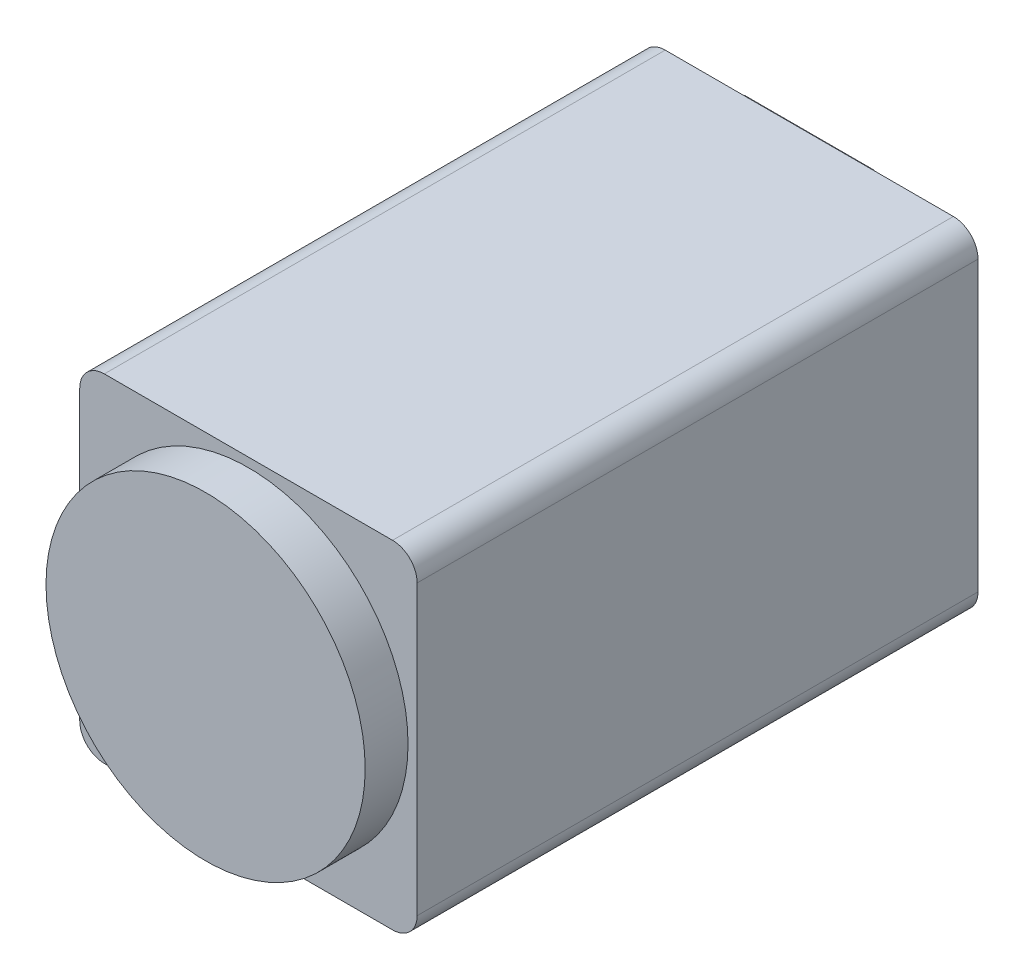
ISO-10303-21;
HEADER;
FILE_DESCRIPTION(('STEP AP214'),'2;1');
FILE_NAME('part.step','',(''),(''),'','','');
FILE_SCHEMA(('AUTOMOTIVE_DESIGN { 1 0 10303 214 1 1 1 1 }'));
ENDSEC;
DATA;
#1=APPLICATION_CONTEXT('core data for automotive mechanical design processes');
#2=APPLICATION_PROTOCOL_DEFINITION('international standard','automotive_design',2000,#1);
#3=PRODUCT_CONTEXT('',#1,'mechanical');
#4=PRODUCT('Part','Part','',(#3));
#5=PRODUCT_RELATED_PRODUCT_CATEGORY('part','',(#4));
#6=PRODUCT_DEFINITION_FORMATION('','',#4);
#7=PRODUCT_DEFINITION_CONTEXT('part definition',#1,'design');
#8=PRODUCT_DEFINITION('design','',#6,#7);
#9=PRODUCT_DEFINITION_SHAPE('','',#8);
#10=(LENGTH_UNIT() NAMED_UNIT(*) SI_UNIT(.MILLI.,.METRE.));
#11=(NAMED_UNIT(*) PLANE_ANGLE_UNIT() SI_UNIT($,.RADIAN.));
#12=(NAMED_UNIT(*) SI_UNIT($,.STERADIAN.) SOLID_ANGLE_UNIT());
#13=UNCERTAINTY_MEASURE_WITH_UNIT(LENGTH_MEASURE(1.E-05),#10,'distance_accuracy_value','');
#14=(GEOMETRIC_REPRESENTATION_CONTEXT(3) GLOBAL_UNCERTAINTY_ASSIGNED_CONTEXT((#13)) GLOBAL_UNIT_ASSIGNED_CONTEXT((#10,
#11,#12)) REPRESENTATION_CONTEXT('',''));
#15=CARTESIAN_POINT('',(0.,0.,0.));
#16=DIRECTION('',(0.,0.,1.));
#17=DIRECTION('',(1.,0.,0.));
#18=AXIS2_PLACEMENT_3D('',#15,#16,#17);
#19=CARTESIAN_POINT('',(2.7,2.7,61.5));
#20=DIRECTION('',(0.,0.,-1.));
#21=DIRECTION('',(-1.,0.,0.));
#22=AXIS2_PLACEMENT_3D('',#19,#20,#21);
#23=CYLINDRICAL_SURFACE('',#22,2.7);
#24=CARTESIAN_POINT('',(2.7,2.7,0.));
#25=DIRECTION('',(0.,0.,-1.));
#26=DIRECTION('',(-1.,0.,0.));
#27=AXIS2_PLACEMENT_3D('',#24,#25,#26);
#28=CIRCLE('',#27,2.7);
#29=CARTESIAN_POINT('',(2.70000000000002,0.,0.));
#30=VERTEX_POINT('',#29);
#31=CARTESIAN_POINT('',(0.,2.70000000000002,0.));
#32=VERTEX_POINT('',#31);
#33=EDGE_CURVE('E165',#30,#32,#28,.T.);
#34=ORIENTED_EDGE('',*,*,#33,.F.);
#35=DIRECTION('',(0.,0.,-1.));
#36=VECTOR('',#35,1.);
#37=CARTESIAN_POINT('',(2.70000000000002,0.,61.5));
#38=LINE('',#37,#36);
#39=CARTESIAN_POINT('',(2.70000000000002,0.,61.5));
#40=VERTEX_POINT('',#39);
#41=EDGE_CURVE('E56',#40,#30,#38,.T.);
#42=ORIENTED_EDGE('',*,*,#41,.F.);
#43=CARTESIAN_POINT('',(2.7,2.7,61.5));
#44=DIRECTION('',(0.,0.,-1.));
#45=DIRECTION('',(-1.,0.,0.));
#46=AXIS2_PLACEMENT_3D('',#43,#44,#45);
#47=CIRCLE('',#46,2.7);
#48=CARTESIAN_POINT('',(0.,2.70000000000002,61.5));
#49=VERTEX_POINT('',#48);
#50=EDGE_CURVE('E194',#40,#49,#47,.T.);
#51=ORIENTED_EDGE('',*,*,#50,.T.);
#52=DIRECTION('',(0.,0.,-1.));
#53=VECTOR('',#52,1.);
#54=CARTESIAN_POINT('',(0.,2.70000000000002,61.5));
#55=LINE('',#54,#53);
#56=EDGE_CURVE('E50',#49,#32,#55,.T.);
#57=ORIENTED_EDGE('',*,*,#56,.T.);
#58=EDGE_LOOP('',(#34,#42,#51,#57));
#59=FACE_BOUND('',#58,.T.);
#60=ADVANCED_FACE('F47',(#59),#23,.T.);
#61=CARTESIAN_POINT('',(2.70000000000002,0.,61.5));
#62=DIRECTION('',(0.,1.,0.));
#63=DIRECTION('',(0.,0.,1.));
#64=AXIS2_PLACEMENT_3D('',#61,#62,#63);
#65=PLANE('',#64);
#66=DIRECTION('',(1.,0.,0.));
#67=VECTOR('',#66,1.);
#68=CARTESIAN_POINT('',(2.70000000000002,0.,0.));
#69=LINE('',#68,#67);
#70=CARTESIAN_POINT('',(34.3,0.,0.));
#71=VERTEX_POINT('',#70);
#72=EDGE_CURVE('E191',#30,#71,#69,.T.);
#73=ORIENTED_EDGE('',*,*,#72,.T.);
#74=DIRECTION('',(0.,0.,-1.));
#75=VECTOR('',#74,1.);
#76=CARTESIAN_POINT('',(34.3,0.,61.5));
#77=LINE('',#76,#75);
#78=CARTESIAN_POINT('',(34.3,0.,61.5));
#79=VERTEX_POINT('',#78);
#80=EDGE_CURVE('E149',#79,#71,#77,.T.);
#81=ORIENTED_EDGE('',*,*,#80,.F.);
#82=DIRECTION('',(1.,0.,0.));
#83=VECTOR('',#82,1.);
#84=CARTESIAN_POINT('',(2.70000000000002,0.,61.5));
#85=LINE('',#84,#83);
#86=EDGE_CURVE('E135',#40,#79,#85,.T.);
#87=ORIENTED_EDGE('',*,*,#86,.F.);
#88=ORIENTED_EDGE('',*,*,#41,.T.);
#89=EDGE_LOOP('',(#73,#81,#87,#88));
#90=FACE_BOUND('',#89,.T.);
#91=ADVANCED_FACE('F214',(#90),#65,.F.);
#92=CARTESIAN_POINT('',(34.3,2.7,61.5));
#93=DIRECTION('',(0.,0.,-1.));
#94=DIRECTION('',(-1.,0.,0.));
#95=AXIS2_PLACEMENT_3D('',#92,#93,#94);
#96=CYLINDRICAL_SURFACE('',#95,2.7);
#97=CARTESIAN_POINT('',(34.3,2.7,0.));
#98=DIRECTION('',(0.,0.,1.));
#99=DIRECTION('',(1.,0.,0.));
#100=AXIS2_PLACEMENT_3D('',#97,#98,#99);
#101=CIRCLE('',#100,2.7);
#102=CARTESIAN_POINT('',(37.,2.7,0.));
#103=VERTEX_POINT('',#102);
#104=EDGE_CURVE('E145',#71,#103,#101,.T.);
#105=ORIENTED_EDGE('',*,*,#104,.T.);
#106=DIRECTION('',(0.,0.,-1.));
#107=VECTOR('',#106,1.);
#108=CARTESIAN_POINT('',(37.,2.7,61.5));
#109=LINE('',#108,#107);
#110=CARTESIAN_POINT('',(37.,2.7,61.5));
#111=VERTEX_POINT('',#110);
#112=EDGE_CURVE('E142',#111,#103,#109,.T.);
#113=ORIENTED_EDGE('',*,*,#112,.F.);
#114=CARTESIAN_POINT('',(34.3,2.7,61.5));
#115=DIRECTION('',(0.,0.,1.));
#116=DIRECTION('',(1.,0.,0.));
#117=AXIS2_PLACEMENT_3D('',#114,#115,#116);
#118=CIRCLE('',#117,2.7);
#119=EDGE_CURVE('E128',#79,#111,#118,.T.);
#120=ORIENTED_EDGE('',*,*,#119,.F.);
#121=ORIENTED_EDGE('',*,*,#80,.T.);
#122=EDGE_LOOP('',(#105,#113,#120,#121));
#123=FACE_BOUND('',#122,.T.);
#124=ADVANCED_FACE('F143',(#123),#96,.T.);
#125=CARTESIAN_POINT('',(37.,2.70000000000002,61.5));
#126=DIRECTION('',(-1.,0.,0.));
#127=DIRECTION('',(0.,0.,1.));
#128=AXIS2_PLACEMENT_3D('',#125,#126,#127);
#129=PLANE('',#128);
#130=DIRECTION('',(0.,1.,0.));
#131=VECTOR('',#130,1.);
#132=CARTESIAN_POINT('',(37.,2.70000000000002,0.));
#133=LINE('',#132,#131);
#134=CARTESIAN_POINT('',(37.,34.3,0.));
#135=VERTEX_POINT('',#134);
#136=EDGE_CURVE('E186',#103,#135,#133,.T.);
#137=ORIENTED_EDGE('',*,*,#136,.T.);
#138=DIRECTION('',(0.,0.,-1.));
#139=VECTOR('',#138,1.);
#140=CARTESIAN_POINT('',(37.,34.3,61.5));
#141=LINE('',#140,#139);
#142=CARTESIAN_POINT('',(37.,34.3,61.5));
#143=VERTEX_POINT('',#142);
#144=EDGE_CURVE('E150',#143,#135,#141,.T.);
#145=ORIENTED_EDGE('',*,*,#144,.F.);
#146=DIRECTION('',(0.,1.,0.));
#147=VECTOR('',#146,1.);
#148=CARTESIAN_POINT('',(37.,2.70000000000002,61.5));
#149=LINE('',#148,#147);
#150=EDGE_CURVE('E133',#111,#143,#149,.T.);
#151=ORIENTED_EDGE('',*,*,#150,.F.);
#152=ORIENTED_EDGE('',*,*,#112,.T.);
#153=EDGE_LOOP('',(#137,#145,#151,#152));
#154=FACE_BOUND('',#153,.T.);
#155=ADVANCED_FACE('F152',(#154),#129,.F.);
#156=CARTESIAN_POINT('',(34.3,34.3,61.5));
#157=DIRECTION('',(0.,0.,-1.));
#158=DIRECTION('',(-1.,0.,0.));
#159=AXIS2_PLACEMENT_3D('',#156,#157,#158);
#160=CYLINDRICAL_SURFACE('',#159,2.7);
#161=CARTESIAN_POINT('',(34.3,34.3,0.));
#162=DIRECTION('',(0.,0.,1.));
#163=DIRECTION('',(1.,0.,0.));
#164=AXIS2_PLACEMENT_3D('',#161,#162,#163);
#165=CIRCLE('',#164,2.7);
#166=CARTESIAN_POINT('',(34.3,37.,0.));
#167=VERTEX_POINT('',#166);
#168=EDGE_CURVE('E182',#135,#167,#165,.T.);
#169=ORIENTED_EDGE('',*,*,#168,.T.);
#170=DIRECTION('',(0.,0.,-1.));
#171=VECTOR('',#170,1.);
#172=CARTESIAN_POINT('',(34.3,37.,61.5));
#173=LINE('',#172,#171);
#174=CARTESIAN_POINT('',(34.3,37.,61.5));
#175=VERTEX_POINT('',#174);
#176=EDGE_CURVE('E201',#175,#167,#173,.T.);
#177=ORIENTED_EDGE('',*,*,#176,.F.);
#178=CARTESIAN_POINT('',(34.3,34.3,61.5));
#179=DIRECTION('',(0.,0.,1.));
#180=DIRECTION('',(1.,0.,0.));
#181=AXIS2_PLACEMENT_3D('',#178,#179,#180);
#182=CIRCLE('',#181,2.7);
#183=EDGE_CURVE('E156',#143,#175,#182,.T.);
#184=ORIENTED_EDGE('',*,*,#183,.F.);
#185=ORIENTED_EDGE('',*,*,#144,.T.);
#186=EDGE_LOOP('',(#169,#177,#184,#185));
#187=FACE_BOUND('',#186,.T.);
#188=ADVANCED_FACE('F233',(#187),#160,.T.);
#189=CARTESIAN_POINT('',(2.70000000000002,37.,61.5));
#190=DIRECTION('',(0.,1.,0.));
#191=DIRECTION('',(0.,0.,1.));
#192=AXIS2_PLACEMENT_3D('',#189,#190,#191);
#193=PLANE('',#192);
#194=DIRECTION('',(1.,0.,0.));
#195=VECTOR('',#194,1.);
#196=CARTESIAN_POINT('',(2.70000000000002,37.,0.));
#197=LINE('',#196,#195);
#198=CARTESIAN_POINT('',(2.70000000000002,37.,0.));
#199=VERTEX_POINT('',#198);
#200=EDGE_CURVE('E178',#199,#167,#197,.T.);
#201=ORIENTED_EDGE('',*,*,#200,.F.);
#202=DIRECTION('',(0.,0.,-1.));
#203=VECTOR('',#202,1.);
#204=CARTESIAN_POINT('',(2.70000000000002,37.,61.5));
#205=LINE('',#204,#203);
#206=CARTESIAN_POINT('',(2.70000000000002,37.,61.5));
#207=VERTEX_POINT('',#206);
#208=EDGE_CURVE('E204',#207,#199,#205,.T.);
#209=ORIENTED_EDGE('',*,*,#208,.F.);
#210=DIRECTION('',(1.,0.,0.));
#211=VECTOR('',#210,1.);
#212=CARTESIAN_POINT('',(2.70000000000002,37.,61.5));
#213=LINE('',#212,#211);
#214=EDGE_CURVE('E159',#207,#175,#213,.T.);
#215=ORIENTED_EDGE('',*,*,#214,.T.);
#216=ORIENTED_EDGE('',*,*,#176,.T.);
#217=EDGE_LOOP('',(#201,#209,#215,#216));
#218=FACE_BOUND('',#217,.T.);
#219=ADVANCED_FACE('F229',(#218),#193,.T.);
#220=CARTESIAN_POINT('',(2.7,34.3,61.5));
#221=DIRECTION('',(0.,0.,-1.));
#222=DIRECTION('',(-1.,0.,0.));
#223=AXIS2_PLACEMENT_3D('',#220,#221,#222);
#224=CYLINDRICAL_SURFACE('',#223,2.7);
#225=CARTESIAN_POINT('',(2.7,34.3,0.));
#226=DIRECTION('',(0.,0.,1.));
#227=DIRECTION('',(1.,0.,0.));
#228=AXIS2_PLACEMENT_3D('',#225,#226,#227);
#229=CIRCLE('',#228,2.7);
#230=CARTESIAN_POINT('',(0.,34.3,0.));
#231=VERTEX_POINT('',#230);
#232=EDGE_CURVE('E174',#199,#231,#229,.T.);
#233=ORIENTED_EDGE('',*,*,#232,.T.);
#234=DIRECTION('',(0.,0.,-1.));
#235=VECTOR('',#234,1.);
#236=CARTESIAN_POINT('',(0.,34.3,61.5));
#237=LINE('',#236,#235);
#238=CARTESIAN_POINT('',(0.,34.3,61.5));
#239=VERTEX_POINT('',#238);
#240=EDGE_CURVE('E206',#239,#231,#237,.T.);
#241=ORIENTED_EDGE('',*,*,#240,.F.);
#242=CARTESIAN_POINT('',(2.7,34.3,61.5));
#243=DIRECTION('',(0.,0.,1.));
#244=DIRECTION('',(1.,0.,0.));
#245=AXIS2_PLACEMENT_3D('',#242,#243,#244);
#246=CIRCLE('',#245,2.7);
#247=EDGE_CURVE('E219',#207,#239,#246,.T.);
#248=ORIENTED_EDGE('',*,*,#247,.F.);
#249=ORIENTED_EDGE('',*,*,#208,.T.);
#250=EDGE_LOOP('',(#233,#241,#248,#249));
#251=FACE_BOUND('',#250,.T.);
#252=ADVANCED_FACE('F236',(#251),#224,.T.);
#253=CARTESIAN_POINT('',(0.,2.70000000000002,61.5));
#254=DIRECTION('',(-1.,0.,0.));
#255=DIRECTION('',(0.,0.,1.));
#256=AXIS2_PLACEMENT_3D('',#253,#254,#255);
#257=PLANE('',#256);
#258=DIRECTION('',(0.,1.,0.));
#259=VECTOR('',#258,1.);
#260=CARTESIAN_POINT('',(0.,2.70000000000002,0.));
#261=LINE('',#260,#259);
#262=EDGE_CURVE('E169',#32,#231,#261,.T.);
#263=ORIENTED_EDGE('',*,*,#262,.F.);
#264=ORIENTED_EDGE('',*,*,#56,.F.);
#265=DIRECTION('',(0.,1.,0.));
#266=VECTOR('',#265,1.);
#267=CARTESIAN_POINT('',(0.,2.70000000000002,61.5));
#268=LINE('',#267,#266);
#269=EDGE_CURVE('E215',#49,#239,#268,.T.);
#270=ORIENTED_EDGE('',*,*,#269,.T.);
#271=ORIENTED_EDGE('',*,*,#240,.T.);
#272=EDGE_LOOP('',(#263,#264,#270,#271));
#273=FACE_BOUND('',#272,.T.);
#274=ADVANCED_FACE('F210',(#273),#257,.T.);
#275=CARTESIAN_POINT('',(2.7,2.7,61.5));
#276=DIRECTION('',(0.,0.,-1.));
#277=DIRECTION('',(-1.,0.,0.));
#278=AXIS2_PLACEMENT_3D('',#275,#276,#277);
#279=PLANE('',#278);
#280=CARTESIAN_POINT('',(18.5,18.5,61.5));
#281=DIRECTION('',(0.,0.,1.));
#282=DIRECTION('',(1.,0.,0.));
#283=AXIS2_PLACEMENT_3D('',#280,#281,#282);
#284=CIRCLE('',#283,17.5);
#285=CARTESIAN_POINT('',(36.,18.5,61.5));
#286=VERTEX_POINT('',#285);
#287=EDGE_CURVE('E12',#286,#286,#284,.T.);
#288=ORIENTED_EDGE('',*,*,#287,.F.);
#289=EDGE_LOOP('',(#288));
#290=FACE_BOUND('',#289,.T.);
#291=ORIENTED_EDGE('',*,*,#50,.F.);
#292=ORIENTED_EDGE('',*,*,#86,.T.);
#293=ORIENTED_EDGE('',*,*,#119,.T.);
#294=ORIENTED_EDGE('',*,*,#150,.T.);
#295=ORIENTED_EDGE('',*,*,#183,.T.);
#296=ORIENTED_EDGE('',*,*,#214,.F.);
#297=ORIENTED_EDGE('',*,*,#247,.T.);
#298=ORIENTED_EDGE('',*,*,#269,.F.);
#299=EDGE_LOOP('',(#291,#292,#293,#294,#295,#296,#297,#298));
#300=FACE_BOUND('',#299,.T.);
#301=ADVANCED_FACE('F131',(#290,#300),#279,.F.);
#302=CARTESIAN_POINT('',(2.7,2.7,0.));
#303=DIRECTION('',(0.,0.,-1.));
#304=DIRECTION('',(-1.,0.,0.));
#305=AXIS2_PLACEMENT_3D('',#302,#303,#304);
#306=PLANE('',#305);
#307=DIRECTION('',(-1.,0.,0.));
#308=VECTOR('',#307,1.);
#309=CARTESIAN_POINT('',(19.3089866841127,30.7562661281153,0.));
#310=LINE('',#309,#308);
#311=CARTESIAN_POINT('',(19.3089866841127,30.7562661281153,0.));
#312=VERTEX_POINT('',#311);
#313=CARTESIAN_POINT('',(5.08087224643994,30.7562661281153,0.));
#314=VERTEX_POINT('',#313);
#315=EDGE_CURVE('E404',#312,#314,#310,.T.);
#316=ORIENTED_EDGE('',*,*,#315,.T.);
#317=DIRECTION('',(0.,1.,0.));
#318=VECTOR('',#317,1.);
#319=CARTESIAN_POINT('',(5.08087224643994,15.203201014323,0.));
#320=LINE('',#319,#318);
#321=CARTESIAN_POINT('',(5.08087224643994,15.203201014323,0.));
#322=VERTEX_POINT('',#321);
#323=EDGE_CURVE('E408',#322,#314,#320,.T.);
#324=ORIENTED_EDGE('',*,*,#323,.F.);
#325=DIRECTION('',(-1.,0.,0.));
#326=VECTOR('',#325,1.);
#327=CARTESIAN_POINT('',(19.3089866841127,15.203201014323,0.));
#328=LINE('',#327,#326);
#329=CARTESIAN_POINT('',(19.3089866841127,15.203201014323,0.));
#330=VERTEX_POINT('',#329);
#331=EDGE_CURVE('E411',#330,#322,#328,.T.);
#332=ORIENTED_EDGE('',*,*,#331,.F.);
#333=DIRECTION('',(0.,1.,0.));
#334=VECTOR('',#333,1.);
#335=CARTESIAN_POINT('',(19.3089866841127,15.203201014323,0.));
#336=LINE('',#335,#334);
#337=EDGE_CURVE('E384',#330,#312,#336,.T.);
#338=ORIENTED_EDGE('',*,*,#337,.T.);
#339=EDGE_LOOP('',(#316,#324,#332,#338));
#340=FACE_BOUND('',#339,.T.);
#341=ORIENTED_EDGE('',*,*,#33,.T.);
#342=ORIENTED_EDGE('',*,*,#262,.T.);
#343=ORIENTED_EDGE('',*,*,#232,.F.);
#344=ORIENTED_EDGE('',*,*,#200,.T.);
#345=ORIENTED_EDGE('',*,*,#168,.F.);
#346=ORIENTED_EDGE('',*,*,#136,.F.);
#347=ORIENTED_EDGE('',*,*,#104,.F.);
#348=ORIENTED_EDGE('',*,*,#72,.F.);
#349=EDGE_LOOP('',(#341,#342,#343,#344,#345,#346,#347,#348));
#350=FACE_BOUND('',#349,.T.);
#351=ADVANCED_FACE('F213',(#340,#350),#306,.T.);
#352=CARTESIAN_POINT('',(18.5,18.5,66.2));
#353=DIRECTION('',(0.,0.,-1.));
#354=DIRECTION('',(-1.,0.,0.));
#355=AXIS2_PLACEMENT_3D('',#352,#353,#354);
#356=CYLINDRICAL_SURFACE('',#355,17.5);
#357=CARTESIAN_POINT('',(18.5,18.5,66.2));
#358=DIRECTION('',(0.,0.,1.));
#359=DIRECTION('',(1.,0.,0.));
#360=AXIS2_PLACEMENT_3D('',#357,#358,#359);
#361=CIRCLE('',#360,17.5);
#362=CARTESIAN_POINT('',(36.,18.5,66.2));
#363=VERTEX_POINT('',#362);
#364=EDGE_CURVE('E170',#363,#363,#361,.T.);
#365=ORIENTED_EDGE('',*,*,#364,.F.);
#366=EDGE_LOOP('',(#365));
#367=FACE_BOUND('',#366,.T.);
#368=ORIENTED_EDGE('',*,*,#287,.T.);
#369=EDGE_LOOP('',(#368));
#370=FACE_BOUND('',#369,.T.);
#371=ADVANCED_FACE('F292',(#367,#370),#356,.T.);
#372=CARTESIAN_POINT('',(0.,0.,66.2));
#373=DIRECTION('',(0.,0.,1.));
#374=DIRECTION('',(1.,0.,0.));
#375=AXIS2_PLACEMENT_3D('',#372,#373,#374);
#376=PLANE('',#375);
#377=ORIENTED_EDGE('',*,*,#364,.T.);
#378=EDGE_LOOP('',(#377));
#379=FACE_BOUND('',#378,.T.);
#380=ADVANCED_FACE('F297',(#379),#376,.T.);
#381=CARTESIAN_POINT('',(19.3089866841127,30.7562661281153,-6.3));
#382=DIRECTION('',(0.,1.,0.));
#383=DIRECTION('',(0.,0.,1.));
#384=AXIS2_PLACEMENT_3D('',#381,#382,#383);
#385=PLANE('',#384);
#386=ORIENTED_EDGE('',*,*,#315,.F.);
#387=DIRECTION('',(0.,0.,1.));
#388=VECTOR('',#387,1.);
#389=CARTESIAN_POINT('',(19.3089866841127,30.7562661281153,-6.3));
#390=LINE('',#389,#388);
#391=CARTESIAN_POINT('',(19.3089866841127,30.7562661281153,-6.3));
#392=VERTEX_POINT('',#391);
#393=EDGE_CURVE('E389',#392,#312,#390,.T.);
#394=ORIENTED_EDGE('',*,*,#393,.F.);
#395=DIRECTION('',(-1.,0.,0.));
#396=VECTOR('',#395,1.);
#397=CARTESIAN_POINT('',(19.3089866841127,30.7562661281153,-6.3));
#398=LINE('',#397,#396);
#399=CARTESIAN_POINT('',(5.08087224643994,30.7562661281153,-6.3));
#400=VERTEX_POINT('',#399);
#401=EDGE_CURVE('E372',#392,#400,#398,.T.);
#402=ORIENTED_EDGE('',*,*,#401,.T.);
#403=DIRECTION('',(0.,0.,1.));
#404=VECTOR('',#403,1.);
#405=CARTESIAN_POINT('',(5.08087224643994,30.7562661281153,-6.3));
#406=LINE('',#405,#404);
#407=EDGE_CURVE('E395',#400,#314,#406,.T.);
#408=ORIENTED_EDGE('',*,*,#407,.T.);
#409=EDGE_LOOP('',(#386,#394,#402,#408));
#410=FACE_BOUND('',#409,.T.);
#411=ADVANCED_FACE('F309',(#410),#385,.T.);
#412=CARTESIAN_POINT('',(19.3089866841127,15.203201014323,-6.3));
#413=DIRECTION('',(1.,0.,0.));
#414=DIRECTION('',(0.,0.,-1.));
#415=AXIS2_PLACEMENT_3D('',#412,#413,#414);
#416=PLANE('',#415);
#417=ORIENTED_EDGE('',*,*,#337,.F.);
#418=DIRECTION('',(0.,0.,1.));
#419=VECTOR('',#418,1.);
#420=CARTESIAN_POINT('',(19.3089866841127,15.203201014323,-6.3));
#421=LINE('',#420,#419);
#422=CARTESIAN_POINT('',(19.3089866841127,15.203201014323,-6.3));
#423=VERTEX_POINT('',#422);
#424=EDGE_CURVE('E392',#423,#330,#421,.T.);
#425=ORIENTED_EDGE('',*,*,#424,.F.);
#426=DIRECTION('',(0.,1.,0.));
#427=VECTOR('',#426,1.);
#428=CARTESIAN_POINT('',(19.3089866841127,15.203201014323,-6.3));
#429=LINE('',#428,#427);
#430=EDGE_CURVE('E376',#423,#392,#429,.T.);
#431=ORIENTED_EDGE('',*,*,#430,.T.);
#432=ORIENTED_EDGE('',*,*,#393,.T.);
#433=EDGE_LOOP('',(#417,#425,#431,#432));
#434=FACE_BOUND('',#433,.T.);
#435=ADVANCED_FACE('F325',(#434),#416,.T.);
#436=CARTESIAN_POINT('',(19.3089866841127,15.203201014323,-6.3));
#437=DIRECTION('',(0.,1.,0.));
#438=DIRECTION('',(0.,0.,1.));
#439=AXIS2_PLACEMENT_3D('',#436,#437,#438);
#440=PLANE('',#439);
#441=ORIENTED_EDGE('',*,*,#331,.T.);
#442=DIRECTION('',(0.,0.,1.));
#443=VECTOR('',#442,1.);
#444=CARTESIAN_POINT('',(5.08087224643994,15.203201014323,-6.3));
#445=LINE('',#444,#443);
#446=CARTESIAN_POINT('',(5.08087224643994,15.203201014323,-6.3));
#447=VERTEX_POINT('',#446);
#448=EDGE_CURVE('E64',#447,#322,#445,.T.);
#449=ORIENTED_EDGE('',*,*,#448,.F.);
#450=DIRECTION('',(-1.,0.,0.));
#451=VECTOR('',#450,1.);
#452=CARTESIAN_POINT('',(19.3089866841127,15.203201014323,-6.3));
#453=LINE('',#452,#451);
#454=EDGE_CURVE('E396',#423,#447,#453,.T.);
#455=ORIENTED_EDGE('',*,*,#454,.F.);
#456=ORIENTED_EDGE('',*,*,#424,.T.);
#457=EDGE_LOOP('',(#441,#449,#455,#456));
#458=FACE_BOUND('',#457,.T.);
#459=ADVANCED_FACE('F335',(#458),#440,.F.);
#460=CARTESIAN_POINT('',(5.08087224643994,15.203201014323,-6.3));
#461=DIRECTION('',(1.,0.,0.));
#462=DIRECTION('',(0.,0.,-1.));
#463=AXIS2_PLACEMENT_3D('',#460,#461,#462);
#464=PLANE('',#463);
#465=ORIENTED_EDGE('',*,*,#323,.T.);
#466=ORIENTED_EDGE('',*,*,#407,.F.);
#467=DIRECTION('',(0.,1.,0.));
#468=VECTOR('',#467,1.);
#469=CARTESIAN_POINT('',(5.08087224643994,15.203201014323,-6.3));
#470=LINE('',#469,#468);
#471=EDGE_CURVE('E378',#447,#400,#470,.T.);
#472=ORIENTED_EDGE('',*,*,#471,.F.);
#473=ORIENTED_EDGE('',*,*,#448,.T.);
#474=EDGE_LOOP('',(#465,#466,#472,#473));
#475=FACE_BOUND('',#474,.T.);
#476=ADVANCED_FACE('F345',(#475),#464,.F.);
#477=CARTESIAN_POINT('',(0.,0.,-6.3));
#478=DIRECTION('',(0.,0.,-1.));
#479=DIRECTION('',(-1.,0.,0.));
#480=AXIS2_PLACEMENT_3D('',#477,#478,#479);
#481=PLANE('',#480);
#482=ORIENTED_EDGE('',*,*,#401,.F.);
#483=ORIENTED_EDGE('',*,*,#430,.F.);
#484=ORIENTED_EDGE('',*,*,#454,.T.);
#485=ORIENTED_EDGE('',*,*,#471,.T.);
#486=EDGE_LOOP('',(#482,#483,#484,#485));
#487=FACE_BOUND('',#486,.T.);
#488=ADVANCED_FACE('F355',(#487),#481,.T.);
#489=CLOSED_SHELL('',(#60,#91,#124,#155,#188,#219,#252,#274,#301,#351,#371,#380,#411,#435,#459,
#476,#488));
#490=MANIFOLD_SOLID_BREP('B2',#489);
#491=ADVANCED_BREP_SHAPE_REPRESENTATION('',(#18,#490),#14);
#492=SHAPE_DEFINITION_REPRESENTATION(#9,#491);
ENDSEC;
END-ISO-10303-21;
